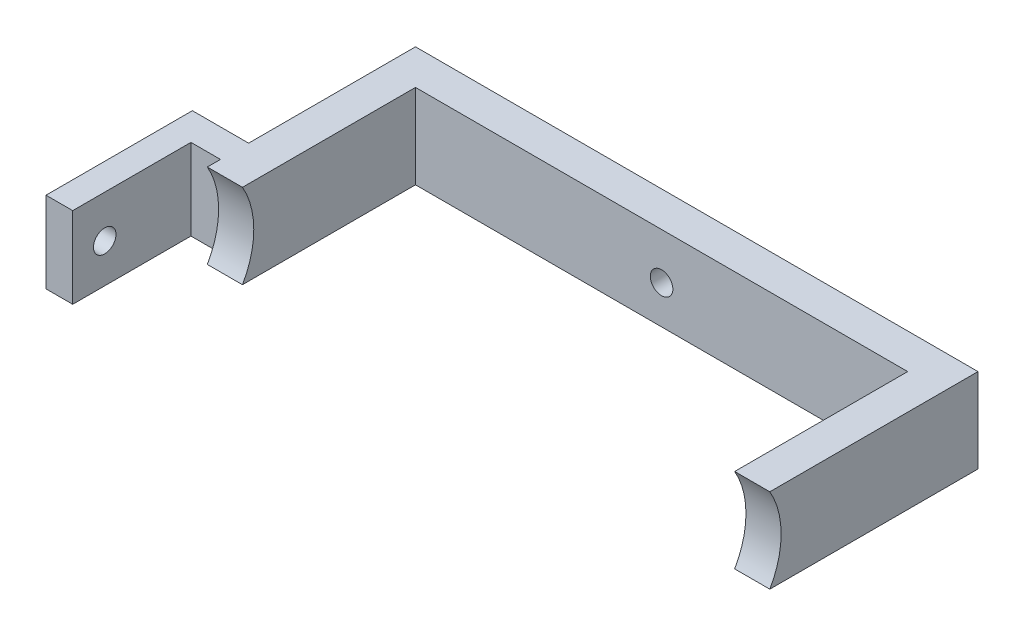
ISO-10303-21;
HEADER;
FILE_DESCRIPTION(('STEP AP214'),'2;1');
FILE_NAME('part.step','',(''),(''),'','','');
FILE_SCHEMA(('AUTOMOTIVE_DESIGN { 1 0 10303 214 1 1 1 1 }'));
ENDSEC;
DATA;
#1=APPLICATION_CONTEXT('core data for automotive mechanical design processes');
#2=APPLICATION_PROTOCOL_DEFINITION('international standard','automotive_design',2000,#1);
#3=PRODUCT_CONTEXT('',#1,'mechanical');
#4=PRODUCT('Part','Part','',(#3));
#5=PRODUCT_RELATED_PRODUCT_CATEGORY('part','',(#4));
#6=PRODUCT_DEFINITION_FORMATION('','',#4);
#7=PRODUCT_DEFINITION_CONTEXT('part definition',#1,'design');
#8=PRODUCT_DEFINITION('design','',#6,#7);
#9=PRODUCT_DEFINITION_SHAPE('','',#8);
#10=(LENGTH_UNIT() NAMED_UNIT(*) SI_UNIT(.MILLI.,.METRE.));
#11=(NAMED_UNIT(*) PLANE_ANGLE_UNIT() SI_UNIT($,.RADIAN.));
#12=(NAMED_UNIT(*) SI_UNIT($,.STERADIAN.) SOLID_ANGLE_UNIT());
#13=UNCERTAINTY_MEASURE_WITH_UNIT(LENGTH_MEASURE(1.E-05),#10,'distance_accuracy_value','');
#14=(GEOMETRIC_REPRESENTATION_CONTEXT(3) GLOBAL_UNCERTAINTY_ASSIGNED_CONTEXT((#13)) GLOBAL_UNIT_ASSIGNED_CONTEXT((#10,
#11,#12)) REPRESENTATION_CONTEXT('',''));
#15=CARTESIAN_POINT('',(0.,0.,0.));
#16=DIRECTION('',(0.,0.,1.));
#17=DIRECTION('',(1.,0.,0.));
#18=AXIS2_PLACEMENT_3D('',#15,#16,#17);
#19=CARTESIAN_POINT('',(494.768772202577,15.,0.));
#20=DIRECTION('',(-1.,0.,0.));
#21=DIRECTION('',(0.,0.,1.));
#22=AXIS2_PLACEMENT_3D('',#19,#20,#21);
#23=CYLINDRICAL_SURFACE('',#22,30.);
#24=DIRECTION('',(1.,0.,0.));
#25=VECTOR('',#24,1.);
#26=CARTESIAN_POINT('',(-101.,30.,-25.9807621135332));
#27=LINE('',#26,#25);
#28=CARTESIAN_POINT('',(100.,30.,-25.9807621135332));
#29=VERTEX_POINT('',#28);
#30=CARTESIAN_POINT('',(87.5000000000002,30.,-25.9807621135332));
#31=VERTEX_POINT('',#30);
#32=EDGE_CURVE('E148',#29,#31,#27,.F.);
#33=ORIENTED_EDGE('',*,*,#32,.T.);
#34=CARTESIAN_POINT('',(87.5,15.,0.));
#35=DIRECTION('',(1.,0.,0.));
#36=DIRECTION('',(0.,0.,-1.));
#37=AXIS2_PLACEMENT_3D('',#34,#35,#36);
#38=CIRCLE('',#37,30.);
#39=CARTESIAN_POINT('',(87.5000000000002,0.,-25.9807621135332));
#40=VERTEX_POINT('',#39);
#41=EDGE_CURVE('E162',#31,#40,#38,.F.);
#42=ORIENTED_EDGE('',*,*,#41,.T.);
#43=DIRECTION('',(1.,0.,0.));
#44=VECTOR('',#43,1.);
#45=CARTESIAN_POINT('',(-101.,0.,-25.9807621135332));
#46=LINE('',#45,#44);
#47=CARTESIAN_POINT('',(100.,0.,-25.9807621135332));
#48=VERTEX_POINT('',#47);
#49=EDGE_CURVE('E156',#48,#40,#46,.F.);
#50=ORIENTED_EDGE('',*,*,#49,.F.);
#51=CARTESIAN_POINT('',(100.,15.,0.));
#52=DIRECTION('',(-1.,0.,0.));
#53=DIRECTION('',(0.,0.,1.));
#54=AXIS2_PLACEMENT_3D('',#51,#52,#53);
#55=CIRCLE('',#54,30.);
#56=EDGE_CURVE('E137',#29,#48,#55,.T.);
#57=ORIENTED_EDGE('',*,*,#56,.F.);
#58=EDGE_LOOP('',(#33,#42,#50,#57));
#59=FACE_BOUND('',#58,.T.);
#60=ADVANCED_FACE('F35',(#59),#23,.F.);
#61=CARTESIAN_POINT('',(87.5,0.,87.5));
#62=DIRECTION('',(1.,0.,0.));
#63=DIRECTION('',(0.,0.,-1.));
#64=AXIS2_PLACEMENT_3D('',#61,#62,#63);
#65=PLANE('',#64);
#66=ORIENTED_EDGE('',*,*,#41,.F.);
#67=DIRECTION('',(0.,0.,-1.));
#68=VECTOR('',#67,1.);
#69=CARTESIAN_POINT('',(87.5,30.,87.5));
#70=LINE('',#69,#68);
#71=CARTESIAN_POINT('',(87.5,30.,-87.5));
#72=VERTEX_POINT('',#71);
#73=EDGE_CURVE('E152',#31,#72,#70,.T.);
#74=ORIENTED_EDGE('',*,*,#73,.T.);
#75=DIRECTION('',(0.,1.,0.));
#76=VECTOR('',#75,1.);
#77=CARTESIAN_POINT('',(87.5,0.,-87.5));
#78=LINE('',#77,#76);
#79=CARTESIAN_POINT('',(87.5,0.,-87.5));
#80=VERTEX_POINT('',#79);
#81=EDGE_CURVE('E226',#80,#72,#78,.T.);
#82=ORIENTED_EDGE('',*,*,#81,.F.);
#83=DIRECTION('',(0.,0.,-1.));
#84=VECTOR('',#83,1.);
#85=CARTESIAN_POINT('',(87.5,0.,87.5));
#86=LINE('',#85,#84);
#87=EDGE_CURVE('E217',#40,#80,#86,.T.);
#88=ORIENTED_EDGE('',*,*,#87,.F.);
#89=EDGE_LOOP('',(#66,#74,#82,#88));
#90=FACE_BOUND('',#89,.T.);
#91=ADVANCED_FACE('F299',(#90),#65,.F.);
#92=CARTESIAN_POINT('',(-87.5,0.,87.5));
#93=DIRECTION('',(-1.,0.,0.));
#94=DIRECTION('',(0.,0.,1.));
#95=AXIS2_PLACEMENT_3D('',#92,#93,#94);
#96=PLANE('',#95);
#97=CARTESIAN_POINT('',(-87.5,15.,0.));
#98=DIRECTION('',(-1.,0.,0.));
#99=DIRECTION('',(0.,0.,1.));
#100=AXIS2_PLACEMENT_3D('',#97,#98,#99);
#101=CIRCLE('',#100,30.);
#102=CARTESIAN_POINT('',(-87.5,0.,-25.9807621135331));
#103=VERTEX_POINT('',#102);
#104=CARTESIAN_POINT('',(-87.5,30.,-25.9807621135332));
#105=VERTEX_POINT('',#104);
#106=EDGE_CURVE('E160',#103,#105,#101,.F.);
#107=ORIENTED_EDGE('',*,*,#106,.F.);
#108=DIRECTION('',(0.,0.,1.));
#109=VECTOR('',#108,1.);
#110=CARTESIAN_POINT('',(-87.5,0.,87.5));
#111=LINE('',#110,#109);
#112=CARTESIAN_POINT('',(-87.5,0.,-87.5));
#113=VERTEX_POINT('',#112);
#114=EDGE_CURVE('E223',#113,#103,#111,.T.);
#115=ORIENTED_EDGE('',*,*,#114,.F.);
#116=DIRECTION('',(0.,1.,0.));
#117=VECTOR('',#116,1.);
#118=CARTESIAN_POINT('',(-87.5,0.,-87.5));
#119=LINE('',#118,#117);
#120=CARTESIAN_POINT('',(-87.5,30.,-87.5));
#121=VERTEX_POINT('',#120);
#122=EDGE_CURVE('E233',#113,#121,#119,.T.);
#123=ORIENTED_EDGE('',*,*,#122,.T.);
#124=DIRECTION('',(0.,0.,1.));
#125=VECTOR('',#124,1.);
#126=CARTESIAN_POINT('',(-87.5,30.,87.5));
#127=LINE('',#126,#125);
#128=EDGE_CURVE('E220',#121,#105,#127,.T.);
#129=ORIENTED_EDGE('',*,*,#128,.T.);
#130=EDGE_LOOP('',(#107,#115,#123,#129));
#131=FACE_BOUND('',#130,.T.);
#132=ADVANCED_FACE('F289',(#131),#96,.F.);
#133=CARTESIAN_POINT('',(100.,30.,-100.));
#134=DIRECTION('',(-1.,0.,0.));
#135=DIRECTION('',(0.,0.,1.));
#136=AXIS2_PLACEMENT_3D('',#133,#134,#135);
#137=PLANE('',#136);
#138=ORIENTED_EDGE('',*,*,#56,.T.);
#139=DIRECTION('',(0.,0.,-1.));
#140=VECTOR('',#139,1.);
#141=CARTESIAN_POINT('',(100.,0.,-100.));
#142=LINE('',#141,#140);
#143=CARTESIAN_POINT('',(100.,0.,-100.));
#144=VERTEX_POINT('',#143);
#145=EDGE_CURVE('E235',#48,#144,#142,.T.);
#146=ORIENTED_EDGE('',*,*,#145,.T.);
#147=DIRECTION('',(0.,-1.,0.));
#148=VECTOR('',#147,1.);
#149=CARTESIAN_POINT('',(100.,30.,-100.));
#150=LINE('',#149,#148);
#151=CARTESIAN_POINT('',(100.,30.,-100.));
#152=VERTEX_POINT('',#151);
#153=EDGE_CURVE('E140',#152,#144,#150,.T.);
#154=ORIENTED_EDGE('',*,*,#153,.F.);
#155=DIRECTION('',(0.,0.,-1.));
#156=VECTOR('',#155,1.);
#157=CARTESIAN_POINT('',(100.,30.,-100.));
#158=LINE('',#157,#156);
#159=EDGE_CURVE('E134',#29,#152,#158,.T.);
#160=ORIENTED_EDGE('',*,*,#159,.F.);
#161=EDGE_LOOP('',(#138,#146,#154,#160));
#162=FACE_BOUND('',#161,.T.);
#163=ADVANCED_FACE('F37',(#162),#137,.F.);
#164=CARTESIAN_POINT('',(-100.,30.,-100.));
#165=DIRECTION('',(1.,0.,0.));
#166=DIRECTION('',(0.,0.,-1.));
#167=AXIS2_PLACEMENT_3D('',#164,#165,#166);
#168=PLANE('',#167);
#169=DIRECTION('',(0.,-1.,0.));
#170=VECTOR('',#169,1.);
#171=CARTESIAN_POINT('',(-100.,30.,-40.6668274564764));
#172=LINE('',#171,#170);
#173=CARTESIAN_POINT('',(-100.,30.,-40.6668274564764));
#174=VERTEX_POINT('',#173);
#175=CARTESIAN_POINT('',(-100.,1.14409561425077,-40.6668274564764));
#176=VERTEX_POINT('',#175);
#177=EDGE_CURVE('E207',#174,#176,#172,.T.);
#178=ORIENTED_EDGE('',*,*,#177,.F.);
#179=DIRECTION('',(0.,0.,1.));
#180=VECTOR('',#179,1.);
#181=CARTESIAN_POINT('',(-100.,30.,-100.));
#182=LINE('',#181,#180);
#183=CARTESIAN_POINT('',(-100.,30.,-100.));
#184=VERTEX_POINT('',#183);
#185=EDGE_CURVE('E239',#184,#174,#182,.T.);
#186=ORIENTED_EDGE('',*,*,#185,.F.);
#187=DIRECTION('',(0.,-1.,0.));
#188=VECTOR('',#187,1.);
#189=CARTESIAN_POINT('',(-100.,30.,-100.));
#190=LINE('',#189,#188);
#191=CARTESIAN_POINT('',(-100.,0.,-100.));
#192=VERTEX_POINT('',#191);
#193=EDGE_CURVE('E242',#184,#192,#190,.T.);
#194=ORIENTED_EDGE('',*,*,#193,.T.);
#195=DIRECTION('',(0.,0.,1.));
#196=VECTOR('',#195,1.);
#197=CARTESIAN_POINT('',(-100.,0.,-100.));
#198=LINE('',#197,#196);
#199=CARTESIAN_POINT('',(-100.,0.,-25.9807621135332));
#200=VERTEX_POINT('',#199);
#201=EDGE_CURVE('E144',#192,#200,#198,.T.);
#202=ORIENTED_EDGE('',*,*,#201,.T.);
#203=CARTESIAN_POINT('',(-100.,15.,0.));
#204=DIRECTION('',(1.,0.,0.));
#205=DIRECTION('',(0.,0.,-1.));
#206=AXIS2_PLACEMENT_3D('',#203,#204,#205);
#207=CIRCLE('',#206,30.);
#208=CARTESIAN_POINT('',(-100.,30.,-25.9807621135332));
#209=VERTEX_POINT('',#208);
#210=EDGE_CURVE('E212',#200,#209,#207,.T.);
#211=ORIENTED_EDGE('',*,*,#210,.T.);
#212=CARTESIAN_POINT('',(-100.,30.,-30.6579049439222));
#213=VERTEX_POINT('',#212);
#214=EDGE_CURVE('E55',#213,#209,#182,.T.);
#215=ORIENTED_EDGE('',*,*,#214,.F.);
#216=DIRECTION('',(0.,1.,0.));
#217=VECTOR('',#216,1.);
#218=CARTESIAN_POINT('',(-100.,30.,-30.6579049439222));
#219=LINE('',#218,#217);
#220=CARTESIAN_POINT('',(-100.,1.14409561425077,-30.6579049439222));
#221=VERTEX_POINT('',#220);
#222=EDGE_CURVE('E205',#221,#213,#219,.T.);
#223=ORIENTED_EDGE('',*,*,#222,.F.);
#224=DIRECTION('',(0.,0.,1.));
#225=VECTOR('',#224,1.);
#226=CARTESIAN_POINT('',(-100.,1.14409561425077,-100.));
#227=LINE('',#226,#225);
#228=EDGE_CURVE('E43',#176,#221,#227,.T.);
#229=ORIENTED_EDGE('',*,*,#228,.F.);
#230=EDGE_LOOP('',(#178,#186,#194,#202,#211,#215,#223,#229));
#231=FACE_BOUND('',#230,.T.);
#232=ADVANCED_FACE('F277',(#231),#168,.F.);
#233=CARTESIAN_POINT('',(0.,13.6147395955971,-150.5));
#234=DIRECTION('',(0.,0.,1.));
#235=DIRECTION('',(1.,0.,0.));
#236=AXIS2_PLACEMENT_3D('',#233,#234,#235);
#237=CYLINDRICAL_SURFACE('',#236,4.);
#238=CARTESIAN_POINT('',(0.,13.6147395955971,-87.5));
#239=DIRECTION('',(0.,0.,-1.));
#240=DIRECTION('',(-1.,0.,0.));
#241=AXIS2_PLACEMENT_3D('',#238,#239,#240);
#242=CIRCLE('',#241,4.);
#243=CARTESIAN_POINT('',(-4.,13.6147395955971,-87.5));
#244=VERTEX_POINT('',#243);
#245=EDGE_CURVE('E155',#244,#244,#242,.T.);
#246=ORIENTED_EDGE('',*,*,#245,.F.);
#247=EDGE_LOOP('',(#246));
#248=FACE_BOUND('',#247,.T.);
#249=CARTESIAN_POINT('',(0.,13.6147395955971,-100.));
#250=DIRECTION('',(0.,0.,1.));
#251=DIRECTION('',(1.,0.,0.));
#252=AXIS2_PLACEMENT_3D('',#249,#250,#251);
#253=CIRCLE('',#252,4.);
#254=CARTESIAN_POINT('',(4.,13.6147395955971,-100.));
#255=VERTEX_POINT('',#254);
#256=EDGE_CURVE('E214',#255,#255,#253,.T.);
#257=ORIENTED_EDGE('',*,*,#256,.F.);
#258=EDGE_LOOP('',(#257));
#259=FACE_BOUND('',#258,.T.);
#260=ADVANCED_FACE('F316',(#248,#259),#237,.F.);
#261=CARTESIAN_POINT('',(-87.5,0.,-87.5));
#262=DIRECTION('',(0.,0.,-1.));
#263=DIRECTION('',(-1.,0.,0.));
#264=AXIS2_PLACEMENT_3D('',#261,#262,#263);
#265=PLANE('',#264);
#266=ORIENTED_EDGE('',*,*,#245,.T.);
#267=EDGE_LOOP('',(#266));
#268=FACE_BOUND('',#267,.T.);
#269=DIRECTION('',(-1.,0.,0.));
#270=VECTOR('',#269,1.);
#271=CARTESIAN_POINT('',(-87.5,30.,-87.5));
#272=LINE('',#271,#270);
#273=EDGE_CURVE('E228',#72,#121,#272,.T.);
#274=ORIENTED_EDGE('',*,*,#273,.T.);
#275=ORIENTED_EDGE('',*,*,#122,.F.);
#276=DIRECTION('',(-1.,0.,0.));
#277=VECTOR('',#276,1.);
#278=CARTESIAN_POINT('',(-87.5,0.,-87.5));
#279=LINE('',#278,#277);
#280=EDGE_CURVE('E219',#80,#113,#279,.T.);
#281=ORIENTED_EDGE('',*,*,#280,.F.);
#282=ORIENTED_EDGE('',*,*,#81,.T.);
#283=EDGE_LOOP('',(#274,#275,#281,#282));
#284=FACE_BOUND('',#283,.T.);
#285=ADVANCED_FACE('F294',(#268,#284),#265,.F.);
#286=CARTESIAN_POINT('',(0.,30.,0.));
#287=DIRECTION('',(0.,1.,0.));
#288=DIRECTION('',(0.,0.,1.));
#289=AXIS2_PLACEMENT_3D('',#286,#287,#288);
#290=PLANE('',#289);
#291=DIRECTION('',(-1.,0.,0.));
#292=VECTOR('',#291,1.);
#293=CARTESIAN_POINT('',(-120.,30.,11.3734027973912));
#294=LINE('',#293,#292);
#295=CARTESIAN_POINT('',(-110.5,30.,11.3734027973912));
#296=VERTEX_POINT('',#295);
#297=CARTESIAN_POINT('',(-120.,30.,11.3734027973912));
#298=VERTEX_POINT('',#297);
#299=EDGE_CURVE('E185',#296,#298,#294,.T.);
#300=ORIENTED_EDGE('',*,*,#299,.F.);
#301=DIRECTION('',(0.,0.,1.));
#302=VECTOR('',#301,1.);
#303=CARTESIAN_POINT('',(-110.5,30.,-40.6668274564764));
#304=LINE('',#303,#302);
#305=CARTESIAN_POINT('',(-110.5,30.,-30.6579049439222));
#306=VERTEX_POINT('',#305);
#307=EDGE_CURVE('E179',#306,#296,#304,.T.);
#308=ORIENTED_EDGE('',*,*,#307,.F.);
#309=DIRECTION('',(-1.,0.,0.));
#310=VECTOR('',#309,1.);
#311=CARTESIAN_POINT('',(-89.4999999999998,30.,-30.6579049439222));
#312=LINE('',#311,#310);
#313=EDGE_CURVE('E200',#213,#306,#312,.T.);
#314=ORIENTED_EDGE('',*,*,#313,.F.);
#315=ORIENTED_EDGE('',*,*,#214,.T.);
#316=EDGE_CURVE('E158',#105,#209,#27,.F.);
#317=ORIENTED_EDGE('',*,*,#316,.F.);
#318=ORIENTED_EDGE('',*,*,#128,.F.);
#319=ORIENTED_EDGE('',*,*,#273,.F.);
#320=ORIENTED_EDGE('',*,*,#73,.F.);
#321=ORIENTED_EDGE('',*,*,#32,.F.);
#322=ORIENTED_EDGE('',*,*,#159,.T.);
#323=DIRECTION('',(-1.,0.,0.));
#324=VECTOR('',#323,1.);
#325=CARTESIAN_POINT('',(-100.,30.,-100.));
#326=LINE('',#325,#324);
#327=EDGE_CURVE('E143',#152,#184,#326,.T.);
#328=ORIENTED_EDGE('',*,*,#327,.T.);
#329=ORIENTED_EDGE('',*,*,#185,.T.);
#330=DIRECTION('',(-1.,0.,0.));
#331=VECTOR('',#330,1.);
#332=CARTESIAN_POINT('',(-89.4999999999998,30.,-40.6668274564764));
#333=LINE('',#332,#331);
#334=CARTESIAN_POINT('',(-120.,30.,-40.6668274564764));
#335=VERTEX_POINT('',#334);
#336=EDGE_CURVE('E203',#174,#335,#333,.T.);
#337=ORIENTED_EDGE('',*,*,#336,.T.);
#338=DIRECTION('',(0.,0.,-1.));
#339=VECTOR('',#338,1.);
#340=CARTESIAN_POINT('',(-120.,30.,-14.6668274564762));
#341=LINE('',#340,#339);
#342=EDGE_CURVE('E182',#298,#335,#341,.T.);
#343=ORIENTED_EDGE('',*,*,#342,.F.);
#344=EDGE_LOOP('',(#300,#308,#314,#315,#317,#318,#319,#320,#321,#322,#328,#329,#337,#343));
#345=FACE_BOUND('',#344,.T.);
#346=ADVANCED_FACE('F150',(#345),#290,.T.);
#347=CARTESIAN_POINT('',(-100.,30.,-100.));
#348=DIRECTION('',(0.,0.,1.));
#349=DIRECTION('',(1.,0.,0.));
#350=AXIS2_PLACEMENT_3D('',#347,#348,#349);
#351=PLANE('',#350);
#352=ORIENTED_EDGE('',*,*,#256,.T.);
#353=EDGE_LOOP('',(#352));
#354=FACE_BOUND('',#353,.T.);
#355=DIRECTION('',(-1.,0.,0.));
#356=VECTOR('',#355,1.);
#357=CARTESIAN_POINT('',(-100.,0.,-100.));
#358=LINE('',#357,#356);
#359=EDGE_CURVE('E244',#144,#192,#358,.T.);
#360=ORIENTED_EDGE('',*,*,#359,.T.);
#361=ORIENTED_EDGE('',*,*,#193,.F.);
#362=ORIENTED_EDGE('',*,*,#327,.F.);
#363=ORIENTED_EDGE('',*,*,#153,.T.);
#364=EDGE_LOOP('',(#360,#361,#362,#363));
#365=FACE_BOUND('',#364,.T.);
#366=ADVANCED_FACE('F280',(#354,#365),#351,.F.);
#367=CARTESIAN_POINT('',(0.,0.,0.));
#368=DIRECTION('',(0.,1.,0.));
#369=DIRECTION('',(0.,0.,1.));
#370=AXIS2_PLACEMENT_3D('',#367,#368,#369);
#371=PLANE('',#370);
#372=ORIENTED_EDGE('',*,*,#145,.F.);
#373=ORIENTED_EDGE('',*,*,#49,.T.);
#374=ORIENTED_EDGE('',*,*,#87,.T.);
#375=ORIENTED_EDGE('',*,*,#280,.T.);
#376=ORIENTED_EDGE('',*,*,#114,.T.);
#377=EDGE_CURVE('E209',#103,#200,#46,.F.);
#378=ORIENTED_EDGE('',*,*,#377,.T.);
#379=ORIENTED_EDGE('',*,*,#201,.F.);
#380=ORIENTED_EDGE('',*,*,#359,.F.);
#381=EDGE_LOOP('',(#372,#373,#374,#375,#376,#378,#379,#380));
#382=FACE_BOUND('',#381,.T.);
#383=ADVANCED_FACE('F284',(#382),#371,.F.);
#384=CARTESIAN_POINT('',(-89.4999999999998,1.14409561425077,-40.6668274564764));
#385=DIRECTION('',(0.,1.,0.));
#386=DIRECTION('',(0.,0.,1.));
#387=AXIS2_PLACEMENT_3D('',#384,#385,#386);
#388=PLANE('',#387);
#389=DIRECTION('',(-1.,0.,0.));
#390=VECTOR('',#389,1.);
#391=CARTESIAN_POINT('',(-89.4999999999998,1.14409561425077,-40.6668274564764));
#392=LINE('',#391,#390);
#393=CARTESIAN_POINT('',(-120.,1.14409561425077,-40.6668274564764));
#394=VERTEX_POINT('',#393);
#395=EDGE_CURVE('E195',#176,#394,#392,.T.);
#396=ORIENTED_EDGE('',*,*,#395,.F.);
#397=ORIENTED_EDGE('',*,*,#228,.T.);
#398=DIRECTION('',(-1.,0.,0.));
#399=VECTOR('',#398,1.);
#400=CARTESIAN_POINT('',(-89.4999999999998,1.14409561425077,-30.6579049439222));
#401=LINE('',#400,#399);
#402=CARTESIAN_POINT('',(-110.5,1.14409561425077,-30.6579049439222));
#403=VERTEX_POINT('',#402);
#404=EDGE_CURVE('E197',#221,#403,#401,.T.);
#405=ORIENTED_EDGE('',*,*,#404,.T.);
#406=DIRECTION('',(0.,0.,1.));
#407=VECTOR('',#406,1.);
#408=CARTESIAN_POINT('',(-110.5,1.14409561425077,-40.6668274564764));
#409=LINE('',#408,#407);
#410=CARTESIAN_POINT('',(-110.5,1.14409561425077,11.3734027973912));
#411=VERTEX_POINT('',#410);
#412=EDGE_CURVE('E177',#403,#411,#409,.T.);
#413=ORIENTED_EDGE('',*,*,#412,.T.);
#414=DIRECTION('',(1.,0.,0.));
#415=VECTOR('',#414,1.);
#416=CARTESIAN_POINT('',(0.,1.14409561425077,11.3734027973912));
#417=LINE('',#416,#415);
#418=CARTESIAN_POINT('',(-120.,1.14409561425077,11.3734027973912));
#419=VERTEX_POINT('',#418);
#420=EDGE_CURVE('E11',#419,#411,#417,.T.);
#421=ORIENTED_EDGE('',*,*,#420,.F.);
#422=DIRECTION('',(0.,0.,1.));
#423=VECTOR('',#422,1.);
#424=CARTESIAN_POINT('',(-120.,1.14409561425077,-40.6668274564764));
#425=LINE('',#424,#423);
#426=EDGE_CURVE('E175',#394,#419,#425,.T.);
#427=ORIENTED_EDGE('',*,*,#426,.F.);
#428=EDGE_LOOP('',(#396,#397,#405,#413,#421,#427));
#429=FACE_BOUND('',#428,.T.);
#430=ADVANCED_FACE('F255',(#429),#388,.F.);
#431=CARTESIAN_POINT('',(-89.4999999999998,30.,-40.6668274564764));
#432=DIRECTION('',(0.,0.,1.));
#433=DIRECTION('',(1.,0.,0.));
#434=AXIS2_PLACEMENT_3D('',#431,#432,#433);
#435=PLANE('',#434);
#436=ORIENTED_EDGE('',*,*,#336,.F.);
#437=ORIENTED_EDGE('',*,*,#177,.T.);
#438=ORIENTED_EDGE('',*,*,#395,.T.);
#439=DIRECTION('',(0.,1.,0.));
#440=VECTOR('',#439,1.);
#441=CARTESIAN_POINT('',(-120.,1.14409561425077,-40.6668274564764));
#442=LINE('',#441,#440);
#443=EDGE_CURVE('E172',#394,#335,#442,.T.);
#444=ORIENTED_EDGE('',*,*,#443,.T.);
#445=EDGE_LOOP('',(#436,#437,#438,#444));
#446=FACE_BOUND('',#445,.T.);
#447=ADVANCED_FACE('F275',(#446),#435,.F.);
#448=CARTESIAN_POINT('',(-89.4999999999998,30.,-30.6579049439222));
#449=DIRECTION('',(0.,0.,-1.));
#450=DIRECTION('',(-1.,0.,0.));
#451=AXIS2_PLACEMENT_3D('',#448,#449,#450);
#452=PLANE('',#451);
#453=ORIENTED_EDGE('',*,*,#404,.F.);
#454=ORIENTED_EDGE('',*,*,#222,.T.);
#455=ORIENTED_EDGE('',*,*,#313,.T.);
#456=DIRECTION('',(0.,-1.,0.));
#457=VECTOR('',#456,1.);
#458=CARTESIAN_POINT('',(-110.5,30.,-30.6579049439222));
#459=LINE('',#458,#457);
#460=EDGE_CURVE('E189',#306,#403,#459,.T.);
#461=ORIENTED_EDGE('',*,*,#460,.T.);
#462=EDGE_LOOP('',(#453,#454,#455,#461));
#463=FACE_BOUND('',#462,.T.);
#464=ADVANCED_FACE('F258',(#463),#452,.F.);
#465=CARTESIAN_POINT('',(-110.5,1.14409561425077,-40.6668274564764));
#466=DIRECTION('',(-1.,0.,0.));
#467=DIRECTION('',(0.,0.,1.));
#468=AXIS2_PLACEMENT_3D('',#465,#466,#467);
#469=PLANE('',#468);
#470=ORIENTED_EDGE('',*,*,#307,.T.);
#471=DIRECTION('',(0.,1.,0.));
#472=VECTOR('',#471,1.);
#473=CARTESIAN_POINT('',(-110.5,0.,11.3734027973912));
#474=LINE('',#473,#472);
#475=EDGE_CURVE('E169',#411,#296,#474,.T.);
#476=ORIENTED_EDGE('',*,*,#475,.F.);
#477=ORIENTED_EDGE('',*,*,#412,.F.);
#478=ORIENTED_EDGE('',*,*,#460,.F.);
#479=EDGE_LOOP('',(#470,#476,#477,#478));
#480=FACE_BOUND('',#479,.T.);
#481=CARTESIAN_POINT('',(-110.5,15.,0.));
#482=DIRECTION('',(-1.,0.,0.));
#483=DIRECTION('',(0.,0.,1.));
#484=AXIS2_PLACEMENT_3D('',#481,#482,#483);
#485=CIRCLE('',#484,4.);
#486=CARTESIAN_POINT('',(-110.5,15.,4.));
#487=VERTEX_POINT('',#486);
#488=EDGE_CURVE('E166',#487,#487,#485,.F.);
#489=ORIENTED_EDGE('',*,*,#488,.F.);
#490=EDGE_LOOP('',(#489));
#491=FACE_BOUND('',#490,.T.);
#492=ADVANCED_FACE('F262',(#480,#491),#469,.F.);
#493=CARTESIAN_POINT('',(-120.,0.,0.));
#494=DIRECTION('',(1.,0.,0.));
#495=DIRECTION('',(0.,0.,-1.));
#496=AXIS2_PLACEMENT_3D('',#493,#494,#495);
#497=PLANE('',#496);
#498=CARTESIAN_POINT('',(-120.,15.,0.));
#499=DIRECTION('',(1.,0.,0.));
#500=DIRECTION('',(0.,0.,-1.));
#501=AXIS2_PLACEMENT_3D('',#498,#499,#500);
#502=CIRCLE('',#501,4.);
#503=CARTESIAN_POINT('',(-120.,15.,-4.));
#504=VERTEX_POINT('',#503);
#505=EDGE_CURVE('E181',#504,#504,#502,.T.);
#506=ORIENTED_EDGE('',*,*,#505,.T.);
#507=EDGE_LOOP('',(#506));
#508=FACE_BOUND('',#507,.T.);
#509=ORIENTED_EDGE('',*,*,#426,.T.);
#510=DIRECTION('',(0.,-1.,0.));
#511=VECTOR('',#510,1.);
#512=CARTESIAN_POINT('',(-120.,0.,11.3734027973912));
#513=LINE('',#512,#511);
#514=EDGE_CURVE('E186',#298,#419,#513,.T.);
#515=ORIENTED_EDGE('',*,*,#514,.F.);
#516=ORIENTED_EDGE('',*,*,#342,.T.);
#517=ORIENTED_EDGE('',*,*,#443,.F.);
#518=EDGE_LOOP('',(#509,#515,#516,#517));
#519=FACE_BOUND('',#518,.T.);
#520=ADVANCED_FACE('F272',(#508,#519),#497,.F.);
#521=CARTESIAN_POINT('',(0.,0.,11.3734027973912));
#522=DIRECTION('',(0.,0.,-1.));
#523=DIRECTION('',(-1.,0.,0.));
#524=AXIS2_PLACEMENT_3D('',#521,#522,#523);
#525=PLANE('',#524);
#526=ORIENTED_EDGE('',*,*,#420,.T.);
#527=ORIENTED_EDGE('',*,*,#475,.T.);
#528=ORIENTED_EDGE('',*,*,#299,.T.);
#529=ORIENTED_EDGE('',*,*,#514,.T.);
#530=EDGE_LOOP('',(#526,#527,#528,#529));
#531=FACE_BOUND('',#530,.T.);
#532=ADVANCED_FACE('F268',(#531),#525,.F.);
#533=CARTESIAN_POINT('',(-131.,15.,0.));
#534=DIRECTION('',(1.,0.,0.));
#535=DIRECTION('',(0.,0.,-1.));
#536=AXIS2_PLACEMENT_3D('',#533,#534,#535);
#537=CYLINDRICAL_SURFACE('',#536,4.);
#538=ORIENTED_EDGE('',*,*,#488,.T.);
#539=EDGE_LOOP('',(#538));
#540=FACE_BOUND('',#539,.T.);
#541=ORIENTED_EDGE('',*,*,#505,.F.);
#542=EDGE_LOOP('',(#541));
#543=FACE_BOUND('',#542,.T.);
#544=ADVANCED_FACE('F340',(#540,#543),#537,.F.);
#545=ORIENTED_EDGE('',*,*,#377,.F.);
#546=ORIENTED_EDGE('',*,*,#106,.T.);
#547=ORIENTED_EDGE('',*,*,#316,.T.);
#548=ORIENTED_EDGE('',*,*,#210,.F.);
#549=EDGE_LOOP('',(#545,#546,#547,#548));
#550=FACE_BOUND('',#549,.T.);
#551=ADVANCED_FACE('F287',(#550),#23,.F.);
#552=CLOSED_SHELL('',(#60,#91,#132,#163,#232,#260,#285,#346,#366,#383,#430,#447,#464,#492,#520,
#532,#544,#551));
#553=MANIFOLD_SOLID_BREP('B2',#552);
#554=ADVANCED_BREP_SHAPE_REPRESENTATION('',(#18,#553),#14);
#555=SHAPE_DEFINITION_REPRESENTATION(#9,#554);
ENDSEC;
END-ISO-10303-21;
